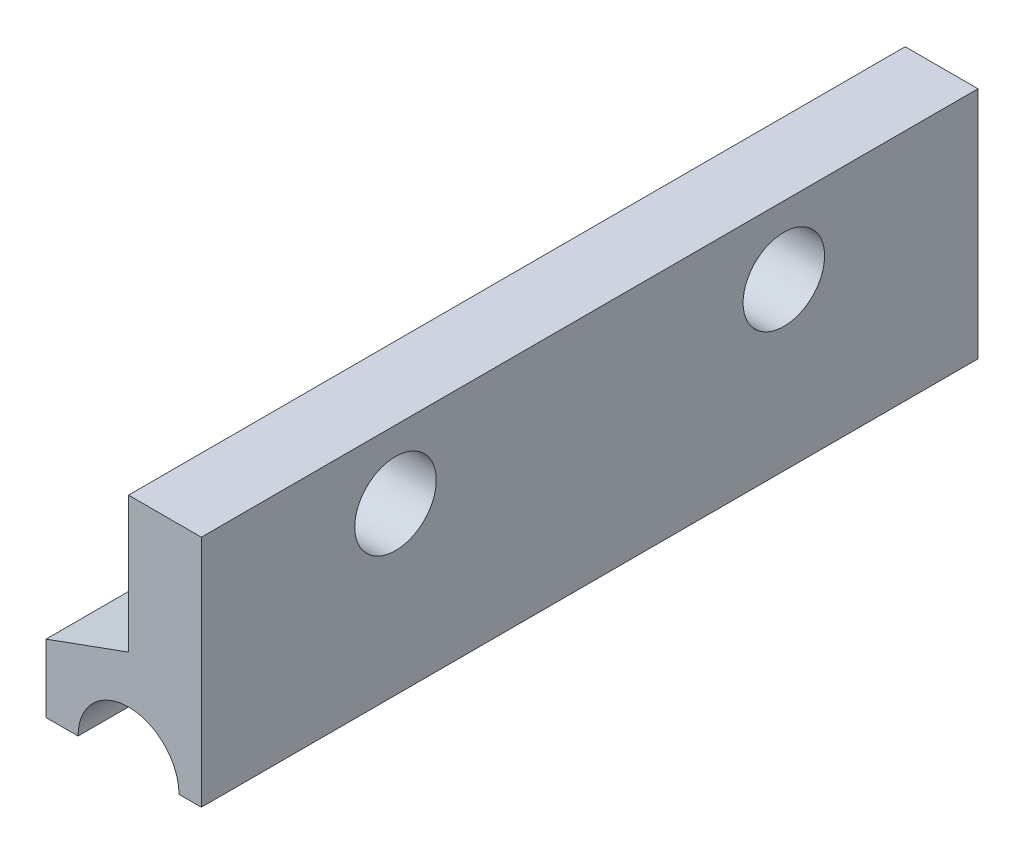
ISO-10303-21;
HEADER;
FILE_DESCRIPTION(('STEP AP214'),'2;1');
FILE_NAME('part.step','',(''),(''),'','','');
FILE_SCHEMA(('AUTOMOTIVE_DESIGN { 1 0 10303 214 1 1 1 1 }'));
ENDSEC;
DATA;
#1=APPLICATION_CONTEXT('core data for automotive mechanical design processes');
#2=APPLICATION_PROTOCOL_DEFINITION('international standard','automotive_design',2000,#1);
#3=PRODUCT_CONTEXT('',#1,'mechanical');
#4=PRODUCT('Part','Part','',(#3));
#5=PRODUCT_RELATED_PRODUCT_CATEGORY('part','',(#4));
#6=PRODUCT_DEFINITION_FORMATION('','',#4);
#7=PRODUCT_DEFINITION_CONTEXT('part definition',#1,'design');
#8=PRODUCT_DEFINITION('design','',#6,#7);
#9=PRODUCT_DEFINITION_SHAPE('','',#8);
#10=(LENGTH_UNIT() NAMED_UNIT(*) SI_UNIT(.MILLI.,.METRE.));
#11=(NAMED_UNIT(*) PLANE_ANGLE_UNIT() SI_UNIT($,.RADIAN.));
#12=(NAMED_UNIT(*) SI_UNIT($,.STERADIAN.) SOLID_ANGLE_UNIT());
#13=UNCERTAINTY_MEASURE_WITH_UNIT(LENGTH_MEASURE(1.E-05),#10,'distance_accuracy_value','');
#14=(GEOMETRIC_REPRESENTATION_CONTEXT(3) GLOBAL_UNCERTAINTY_ASSIGNED_CONTEXT((#13)) GLOBAL_UNIT_ASSIGNED_CONTEXT((#10,
#11,#12)) REPRESENTATION_CONTEXT('',''));
#15=CARTESIAN_POINT('',(0.,0.,0.));
#16=DIRECTION('',(0.,0.,1.));
#17=DIRECTION('',(1.,0.,0.));
#18=AXIS2_PLACEMENT_3D('',#15,#16,#17);
#19=CARTESIAN_POINT('',(0.,0.,40.));
#20=DIRECTION('',(0.,0.,-1.));
#21=DIRECTION('',(-1.,0.,0.));
#22=AXIS2_PLACEMENT_3D('',#19,#20,#21);
#23=CYLINDRICAL_SURFACE('',#22,2.6);
#24=CARTESIAN_POINT('',(0.,0.,0.));
#25=DIRECTION('',(0.,0.,-1.));
#26=DIRECTION('',(1.,0.,0.));
#27=AXIS2_PLACEMENT_3D('',#24,#25,#26);
#28=CIRCLE('',#27,2.6);
#29=CARTESIAN_POINT('',(-2.6,0.,0.));
#30=VERTEX_POINT('',#29);
#31=CARTESIAN_POINT('',(2.6,0.,0.));
#32=VERTEX_POINT('',#31);
#33=EDGE_CURVE('E128',#30,#32,#28,.T.);
#34=ORIENTED_EDGE('',*,*,#33,.T.);
#35=DIRECTION('',(0.,0.,-1.));
#36=VECTOR('',#35,1.);
#37=CARTESIAN_POINT('',(2.6,0.,40.));
#38=LINE('',#37,#36);
#39=CARTESIAN_POINT('',(2.6,0.,40.));
#40=VERTEX_POINT('',#39);
#41=EDGE_CURVE('E11',#40,#32,#38,.T.);
#42=ORIENTED_EDGE('',*,*,#41,.F.);
#43=CARTESIAN_POINT('',(0.,0.,40.));
#44=DIRECTION('',(0.,0.,-1.));
#45=DIRECTION('',(1.,0.,0.));
#46=AXIS2_PLACEMENT_3D('',#43,#44,#45);
#47=CIRCLE('',#46,2.6);
#48=CARTESIAN_POINT('',(-2.6,0.,40.));
#49=VERTEX_POINT('',#48);
#50=EDGE_CURVE('E143',#49,#40,#47,.T.);
#51=ORIENTED_EDGE('',*,*,#50,.F.);
#52=DIRECTION('',(0.,0.,-1.));
#53=VECTOR('',#52,1.);
#54=CARTESIAN_POINT('',(-2.6,0.,40.));
#55=LINE('',#54,#53);
#56=EDGE_CURVE('E124',#49,#30,#55,.T.);
#57=ORIENTED_EDGE('',*,*,#56,.T.);
#58=EDGE_LOOP('',(#34,#42,#51,#57));
#59=FACE_BOUND('',#58,.T.);
#60=ADVANCED_FACE('F32',(#59),#23,.F.);
#61=CARTESIAN_POINT('',(3.75,0.,40.));
#62=DIRECTION('',(0.,1.,0.));
#63=DIRECTION('',(-1.,0.,0.));
#64=AXIS2_PLACEMENT_3D('',#61,#62,#63);
#65=PLANE('',#64);
#66=DIRECTION('',(1.,0.,0.));
#67=VECTOR('',#66,1.);
#68=CARTESIAN_POINT('',(3.75,0.,0.));
#69=LINE('',#68,#67);
#70=CARTESIAN_POINT('',(3.75,0.,0.));
#71=VERTEX_POINT('',#70);
#72=EDGE_CURVE('E131',#32,#71,#69,.T.);
#73=ORIENTED_EDGE('',*,*,#72,.T.);
#74=DIRECTION('',(0.,0.,-1.));
#75=VECTOR('',#74,1.);
#76=CARTESIAN_POINT('',(3.75,0.,40.));
#77=LINE('',#76,#75);
#78=CARTESIAN_POINT('',(3.75,0.,40.));
#79=VERTEX_POINT('',#78);
#80=EDGE_CURVE('E40',#79,#71,#77,.T.);
#81=ORIENTED_EDGE('',*,*,#80,.F.);
#82=DIRECTION('',(1.,0.,0.));
#83=VECTOR('',#82,1.);
#84=CARTESIAN_POINT('',(3.75,0.,40.));
#85=LINE('',#84,#83);
#86=EDGE_CURVE('E91',#40,#79,#85,.T.);
#87=ORIENTED_EDGE('',*,*,#86,.F.);
#88=ORIENTED_EDGE('',*,*,#41,.T.);
#89=EDGE_LOOP('',(#73,#81,#87,#88));
#90=FACE_BOUND('',#89,.T.);
#91=ADVANCED_FACE('F212',(#90),#65,.F.);
#92=CARTESIAN_POINT('',(3.75,12.0468734956313,40.));
#93=DIRECTION('',(-1.,0.,0.));
#94=DIRECTION('',(0.,-1.,0.));
#95=AXIS2_PLACEMENT_3D('',#92,#93,#94);
#96=PLANE('',#95);
#97=CARTESIAN_POINT('',(3.75,8.54687349563135,10.));
#98=DIRECTION('',(-1.,0.,0.));
#99=DIRECTION('',(0.,0.,1.));
#100=AXIS2_PLACEMENT_3D('',#97,#98,#99);
#101=CIRCLE('',#100,2.1);
#102=CARTESIAN_POINT('',(3.75,8.54687349563135,12.1));
#103=VERTEX_POINT('',#102);
#104=EDGE_CURVE('E132',#103,#103,#101,.T.);
#105=ORIENTED_EDGE('',*,*,#104,.T.);
#106=EDGE_LOOP('',(#105));
#107=FACE_BOUND('',#106,.T.);
#108=CARTESIAN_POINT('',(3.75,8.54687349563135,30.));
#109=DIRECTION('',(-1.,0.,0.));
#110=DIRECTION('',(0.,0.,1.));
#111=AXIS2_PLACEMENT_3D('',#108,#109,#110);
#112=CIRCLE('',#111,2.09999999999999);
#113=CARTESIAN_POINT('',(3.75,8.54687349563135,32.1));
#114=VERTEX_POINT('',#113);
#115=EDGE_CURVE('E179',#114,#114,#112,.T.);
#116=ORIENTED_EDGE('',*,*,#115,.T.);
#117=EDGE_LOOP('',(#116));
#118=FACE_BOUND('',#117,.T.);
#119=DIRECTION('',(0.,1.,0.));
#120=VECTOR('',#119,1.);
#121=CARTESIAN_POINT('',(3.75,12.0468734956313,0.));
#122=LINE('',#121,#120);
#123=CARTESIAN_POINT('',(3.75,12.0468734956313,0.));
#124=VERTEX_POINT('',#123);
#125=EDGE_CURVE('E134',#71,#124,#122,.T.);
#126=ORIENTED_EDGE('',*,*,#125,.T.);
#127=DIRECTION('',(0.,0.,-1.));
#128=VECTOR('',#127,1.);
#129=CARTESIAN_POINT('',(3.75,12.0468734956313,40.));
#130=LINE('',#129,#128);
#131=CARTESIAN_POINT('',(3.75,12.0468734956313,40.));
#132=VERTEX_POINT('',#131);
#133=EDGE_CURVE('E150',#132,#124,#130,.T.);
#134=ORIENTED_EDGE('',*,*,#133,.F.);
#135=DIRECTION('',(0.,1.,0.));
#136=VECTOR('',#135,1.);
#137=CARTESIAN_POINT('',(3.75,12.0468734956313,40.));
#138=LINE('',#137,#136);
#139=EDGE_CURVE('E158',#79,#132,#138,.T.);
#140=ORIENTED_EDGE('',*,*,#139,.F.);
#141=ORIENTED_EDGE('',*,*,#80,.T.);
#142=EDGE_LOOP('',(#126,#134,#140,#141));
#143=FACE_BOUND('',#142,.T.);
#144=ADVANCED_FACE('F156',(#107,#118,#143),#96,.F.);
#145=CARTESIAN_POINT('',(0.,12.0468734956313,40.));
#146=DIRECTION('',(0.,-1.,0.));
#147=DIRECTION('',(0.,0.,-1.));
#148=AXIS2_PLACEMENT_3D('',#145,#146,#147);
#149=PLANE('',#148);
#150=DIRECTION('',(-1.,0.,0.));
#151=VECTOR('',#150,1.);
#152=CARTESIAN_POINT('',(0.,12.0468734956313,0.));
#153=LINE('',#152,#151);
#154=CARTESIAN_POINT('',(0.,12.0468734956313,0.));
#155=VERTEX_POINT('',#154);
#156=EDGE_CURVE('E136',#124,#155,#153,.T.);
#157=ORIENTED_EDGE('',*,*,#156,.T.);
#158=DIRECTION('',(0.,0.,-1.));
#159=VECTOR('',#158,1.);
#160=CARTESIAN_POINT('',(0.,12.0468734956313,40.));
#161=LINE('',#160,#159);
#162=CARTESIAN_POINT('',(0.,12.0468734956313,40.));
#163=VERTEX_POINT('',#162);
#164=EDGE_CURVE('E147',#163,#155,#161,.T.);
#165=ORIENTED_EDGE('',*,*,#164,.F.);
#166=DIRECTION('',(-1.,0.,0.));
#167=VECTOR('',#166,1.);
#168=CARTESIAN_POINT('',(0.,12.0468734956313,40.));
#169=LINE('',#168,#167);
#170=EDGE_CURVE('E170',#132,#163,#169,.T.);
#171=ORIENTED_EDGE('',*,*,#170,.F.);
#172=ORIENTED_EDGE('',*,*,#133,.T.);
#173=EDGE_LOOP('',(#157,#165,#171,#172));
#174=FACE_BOUND('',#173,.T.);
#175=ADVANCED_FACE('F166',(#174),#149,.F.);
#176=CARTESIAN_POINT('',(0.,5.04687349563135,40.));
#177=DIRECTION('',(1.,0.,0.));
#178=DIRECTION('',(0.,1.,0.));
#179=AXIS2_PLACEMENT_3D('',#176,#177,#178);
#180=PLANE('',#179);
#181=CARTESIAN_POINT('',(0.,8.54687349563135,10.));
#182=DIRECTION('',(-1.,0.,0.));
#183=DIRECTION('',(0.,0.,1.));
#184=AXIS2_PLACEMENT_3D('',#181,#182,#183);
#185=CIRCLE('',#184,2.1);
#186=CARTESIAN_POINT('',(0.,8.54687349563135,12.1));
#187=VERTEX_POINT('',#186);
#188=EDGE_CURVE('E182',#187,#187,#185,.T.);
#189=ORIENTED_EDGE('',*,*,#188,.F.);
#190=EDGE_LOOP('',(#189));
#191=FACE_BOUND('',#190,.T.);
#192=CARTESIAN_POINT('',(0.,8.54687349563135,30.));
#193=DIRECTION('',(-1.,0.,0.));
#194=DIRECTION('',(0.,0.,1.));
#195=AXIS2_PLACEMENT_3D('',#192,#193,#194);
#196=CIRCLE('',#195,2.09999999999999);
#197=CARTESIAN_POINT('',(0.,8.54687349563135,32.1));
#198=VERTEX_POINT('',#197);
#199=EDGE_CURVE('E176',#198,#198,#196,.T.);
#200=ORIENTED_EDGE('',*,*,#199,.F.);
#201=EDGE_LOOP('',(#200));
#202=FACE_BOUND('',#201,.T.);
#203=DIRECTION('',(0.,-1.,0.));
#204=VECTOR('',#203,1.);
#205=CARTESIAN_POINT('',(0.,5.04687349563135,0.));
#206=LINE('',#205,#204);
#207=CARTESIAN_POINT('',(0.,5.04687349563135,0.));
#208=VERTEX_POINT('',#207);
#209=EDGE_CURVE('E138',#155,#208,#206,.T.);
#210=ORIENTED_EDGE('',*,*,#209,.T.);
#211=DIRECTION('',(0.,0.,-1.));
#212=VECTOR('',#211,1.);
#213=CARTESIAN_POINT('',(0.,5.04687349563135,40.));
#214=LINE('',#213,#212);
#215=CARTESIAN_POINT('',(0.,5.04687349563135,40.));
#216=VERTEX_POINT('',#215);
#217=EDGE_CURVE('E119',#216,#208,#214,.T.);
#218=ORIENTED_EDGE('',*,*,#217,.F.);
#219=DIRECTION('',(0.,-1.,0.));
#220=VECTOR('',#219,1.);
#221=CARTESIAN_POINT('',(0.,5.04687349563135,40.));
#222=LINE('',#221,#220);
#223=EDGE_CURVE('E110',#163,#216,#222,.T.);
#224=ORIENTED_EDGE('',*,*,#223,.F.);
#225=ORIENTED_EDGE('',*,*,#164,.T.);
#226=EDGE_LOOP('',(#210,#218,#224,#225));
#227=FACE_BOUND('',#226,.T.);
#228=ADVANCED_FACE('F169',(#191,#202,#227),#180,.F.);
#229=CARTESIAN_POINT('',(-4.25,3.5,40.));
#230=DIRECTION('',(0.342020143325666,-0.939692620785909,0.));
#231=DIRECTION('',(0.93969262078591,0.342020143325666,0.));
#232=AXIS2_PLACEMENT_3D('',#229,#230,#231);
#233=PLANE('',#232);
#234=DIRECTION('',(-0.939692620785909,-0.342020143325666,0.));
#235=VECTOR('',#234,1.);
#236=CARTESIAN_POINT('',(-4.25,3.5,0.));
#237=LINE('',#236,#235);
#238=CARTESIAN_POINT('',(-4.25,3.5,0.));
#239=VERTEX_POINT('',#238);
#240=EDGE_CURVE('E118',#208,#239,#237,.T.);
#241=ORIENTED_EDGE('',*,*,#240,.T.);
#242=DIRECTION('',(0.,0.,-1.));
#243=VECTOR('',#242,1.);
#244=CARTESIAN_POINT('',(-4.25,3.5,40.));
#245=LINE('',#244,#243);
#246=CARTESIAN_POINT('',(-4.25,3.5,40.));
#247=VERTEX_POINT('',#246);
#248=EDGE_CURVE('E115',#247,#239,#245,.T.);
#249=ORIENTED_EDGE('',*,*,#248,.F.);
#250=DIRECTION('',(-0.939692620785909,-0.342020143325666,0.));
#251=VECTOR('',#250,1.);
#252=CARTESIAN_POINT('',(-4.25,3.5,40.));
#253=LINE('',#252,#251);
#254=EDGE_CURVE('E104',#216,#247,#253,.T.);
#255=ORIENTED_EDGE('',*,*,#254,.F.);
#256=ORIENTED_EDGE('',*,*,#217,.T.);
#257=EDGE_LOOP('',(#241,#249,#255,#256));
#258=FACE_BOUND('',#257,.T.);
#259=ADVANCED_FACE('F116',(#258),#233,.F.);
#260=CARTESIAN_POINT('',(-4.25,0.,40.));
#261=DIRECTION('',(1.,0.,0.));
#262=DIRECTION('',(0.,0.,-1.));
#263=AXIS2_PLACEMENT_3D('',#260,#261,#262);
#264=PLANE('',#263);
#265=DIRECTION('',(0.,-1.,0.));
#266=VECTOR('',#265,1.);
#267=CARTESIAN_POINT('',(-4.25,0.,0.));
#268=LINE('',#267,#266);
#269=CARTESIAN_POINT('',(-4.25,0.,0.));
#270=VERTEX_POINT('',#269);
#271=EDGE_CURVE('E77',#239,#270,#268,.T.);
#272=ORIENTED_EDGE('',*,*,#271,.T.);
#273=DIRECTION('',(0.,0.,-1.));
#274=VECTOR('',#273,1.);
#275=CARTESIAN_POINT('',(-4.25,0.,40.));
#276=LINE('',#275,#274);
#277=CARTESIAN_POINT('',(-4.25,0.,40.));
#278=VERTEX_POINT('',#277);
#279=EDGE_CURVE('E120',#278,#270,#276,.T.);
#280=ORIENTED_EDGE('',*,*,#279,.F.);
#281=DIRECTION('',(0.,-1.,0.));
#282=VECTOR('',#281,1.);
#283=CARTESIAN_POINT('',(-4.25,0.,40.));
#284=LINE('',#283,#282);
#285=EDGE_CURVE('E108',#247,#278,#284,.T.);
#286=ORIENTED_EDGE('',*,*,#285,.F.);
#287=ORIENTED_EDGE('',*,*,#248,.T.);
#288=EDGE_LOOP('',(#272,#280,#286,#287));
#289=FACE_BOUND('',#288,.T.);
#290=ADVANCED_FACE('F122',(#289),#264,.F.);
#291=CARTESIAN_POINT('',(-2.6,0.,40.));
#292=DIRECTION('',(0.,1.,0.));
#293=DIRECTION('',(-1.,0.,0.));
#294=AXIS2_PLACEMENT_3D('',#291,#292,#293);
#295=PLANE('',#294);
#296=DIRECTION('',(1.,0.,0.));
#297=VECTOR('',#296,1.);
#298=CARTESIAN_POINT('',(-2.6,0.,0.));
#299=LINE('',#298,#297);
#300=EDGE_CURVE('E83',#270,#30,#299,.T.);
#301=ORIENTED_EDGE('',*,*,#300,.T.);
#302=ORIENTED_EDGE('',*,*,#56,.F.);
#303=DIRECTION('',(1.,0.,0.));
#304=VECTOR('',#303,1.);
#305=CARTESIAN_POINT('',(-2.6,0.,40.));
#306=LINE('',#305,#304);
#307=EDGE_CURVE('E48',#278,#49,#306,.T.);
#308=ORIENTED_EDGE('',*,*,#307,.F.);
#309=ORIENTED_EDGE('',*,*,#279,.T.);
#310=EDGE_LOOP('',(#301,#302,#308,#309));
#311=FACE_BOUND('',#310,.T.);
#312=ADVANCED_FACE('F219',(#311),#295,.F.);
#313=CARTESIAN_POINT('',(0.,0.,40.));
#314=DIRECTION('',(0.,0.,1.));
#315=DIRECTION('',(1.,0.,0.));
#316=AXIS2_PLACEMENT_3D('',#313,#314,#315);
#317=PLANE('',#316);
#318=ORIENTED_EDGE('',*,*,#50,.T.);
#319=ORIENTED_EDGE('',*,*,#86,.T.);
#320=ORIENTED_EDGE('',*,*,#139,.T.);
#321=ORIENTED_EDGE('',*,*,#170,.T.);
#322=ORIENTED_EDGE('',*,*,#223,.T.);
#323=ORIENTED_EDGE('',*,*,#254,.T.);
#324=ORIENTED_EDGE('',*,*,#285,.T.);
#325=ORIENTED_EDGE('',*,*,#307,.T.);
#326=EDGE_LOOP('',(#318,#319,#320,#321,#322,#323,#324,#325));
#327=FACE_BOUND('',#326,.T.);
#328=ADVANCED_FACE('F106',(#327),#317,.T.);
#329=CARTESIAN_POINT('',(0.,0.,0.));
#330=DIRECTION('',(0.,0.,1.));
#331=DIRECTION('',(1.,0.,0.));
#332=AXIS2_PLACEMENT_3D('',#329,#330,#331);
#333=PLANE('',#332);
#334=ORIENTED_EDGE('',*,*,#33,.F.);
#335=ORIENTED_EDGE('',*,*,#300,.F.);
#336=ORIENTED_EDGE('',*,*,#271,.F.);
#337=ORIENTED_EDGE('',*,*,#240,.F.);
#338=ORIENTED_EDGE('',*,*,#209,.F.);
#339=ORIENTED_EDGE('',*,*,#156,.F.);
#340=ORIENTED_EDGE('',*,*,#125,.F.);
#341=ORIENTED_EDGE('',*,*,#72,.F.);
#342=EDGE_LOOP('',(#334,#335,#336,#337,#338,#339,#340,#341));
#343=FACE_BOUND('',#342,.T.);
#344=ADVANCED_FACE('F162',(#343),#333,.F.);
#345=CARTESIAN_POINT('',(3.75,8.54687349563135,30.));
#346=DIRECTION('',(-1.,0.,0.));
#347=DIRECTION('',(0.,0.,1.));
#348=AXIS2_PLACEMENT_3D('',#345,#346,#347);
#349=CYLINDRICAL_SURFACE('',#348,2.09999999999999);
#350=ORIENTED_EDGE('',*,*,#115,.F.);
#351=EDGE_LOOP('',(#350));
#352=FACE_BOUND('',#351,.T.);
#353=ORIENTED_EDGE('',*,*,#199,.T.);
#354=EDGE_LOOP('',(#353));
#355=FACE_BOUND('',#354,.T.);
#356=ADVANCED_FACE('F193',(#352,#355),#349,.F.);
#357=CARTESIAN_POINT('',(3.75,8.54687349563135,10.));
#358=DIRECTION('',(-1.,0.,0.));
#359=DIRECTION('',(0.,0.,1.));
#360=AXIS2_PLACEMENT_3D('',#357,#358,#359);
#361=CYLINDRICAL_SURFACE('',#360,2.1);
#362=ORIENTED_EDGE('',*,*,#104,.F.);
#363=EDGE_LOOP('',(#362));
#364=FACE_BOUND('',#363,.T.);
#365=ORIENTED_EDGE('',*,*,#188,.T.);
#366=EDGE_LOOP('',(#365));
#367=FACE_BOUND('',#366,.T.);
#368=ADVANCED_FACE('F190',(#364,#367),#361,.F.);
#369=CLOSED_SHELL('',(#60,#91,#144,#175,#228,#259,#290,#312,#328,#344,#356,#368));
#370=MANIFOLD_SOLID_BREP('B2',#369);
#371=ADVANCED_BREP_SHAPE_REPRESENTATION('',(#18,#370),#14);
#372=SHAPE_DEFINITION_REPRESENTATION(#9,#371);
ENDSEC;
END-ISO-10303-21;
